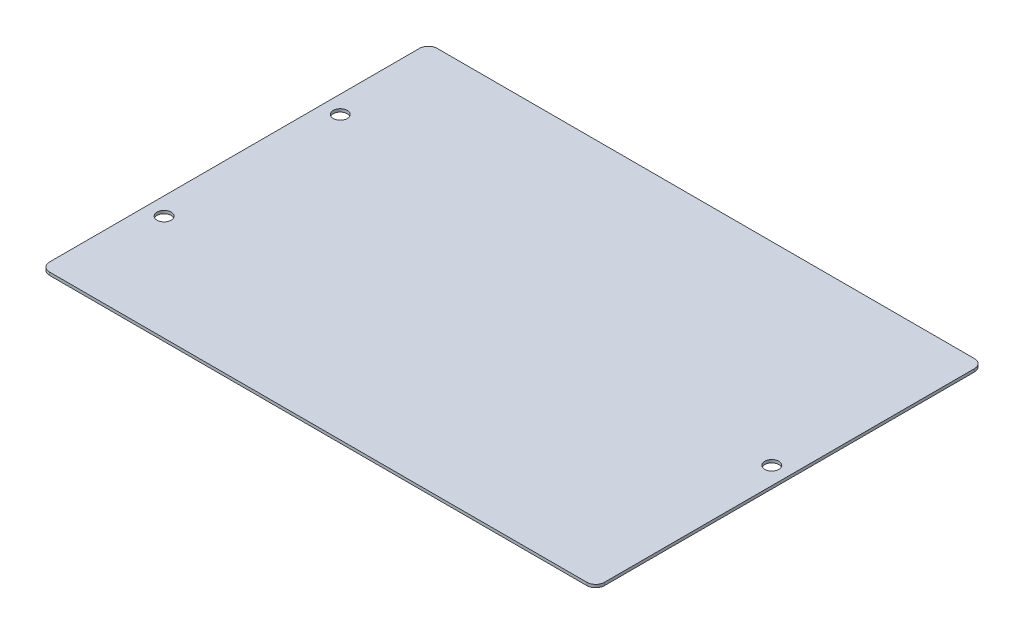
ISO-10303-21;
HEADER;
FILE_DESCRIPTION(('STEP AP214'),'2;1');
FILE_NAME('part.step','',(''),(''),'','','');
FILE_SCHEMA(('AUTOMOTIVE_DESIGN { 1 0 10303 214 1 1 1 1 }'));
ENDSEC;
DATA;
#1=APPLICATION_CONTEXT('core data for automotive mechanical design processes');
#2=APPLICATION_PROTOCOL_DEFINITION('international standard','automotive_design',2000,#1);
#3=PRODUCT_CONTEXT('',#1,'mechanical');
#4=PRODUCT('Part','Part','',(#3));
#5=PRODUCT_RELATED_PRODUCT_CATEGORY('part','',(#4));
#6=PRODUCT_DEFINITION_FORMATION('','',#4);
#7=PRODUCT_DEFINITION_CONTEXT('part definition',#1,'design');
#8=PRODUCT_DEFINITION('design','',#6,#7);
#9=PRODUCT_DEFINITION_SHAPE('','',#8);
#10=(LENGTH_UNIT() NAMED_UNIT(*) SI_UNIT(.MILLI.,.METRE.));
#11=(NAMED_UNIT(*) PLANE_ANGLE_UNIT() SI_UNIT($,.RADIAN.));
#12=(NAMED_UNIT(*) SI_UNIT($,.STERADIAN.) SOLID_ANGLE_UNIT());
#13=UNCERTAINTY_MEASURE_WITH_UNIT(LENGTH_MEASURE(1.E-05),#10,'distance_accuracy_value','');
#14=(GEOMETRIC_REPRESENTATION_CONTEXT(3) GLOBAL_UNCERTAINTY_ASSIGNED_CONTEXT((#13)) GLOBAL_UNIT_ASSIGNED_CONTEXT((#10,
#11,#12)) REPRESENTATION_CONTEXT('',''));
#15=CARTESIAN_POINT('',(0.,0.,0.));
#16=DIRECTION('',(0.,0.,1.));
#17=DIRECTION('',(1.,0.,0.));
#18=AXIS2_PLACEMENT_3D('',#15,#16,#17);
#19=CARTESIAN_POINT('',(94.5,1.,-66.));
#20=DIRECTION('',(-1.,0.,0.));
#21=DIRECTION('',(0.,0.,1.));
#22=AXIS2_PLACEMENT_3D('',#19,#20,#21);
#23=PLANE('',#22);
#24=DIRECTION('',(0.,0.,-1.));
#25=VECTOR('',#24,1.);
#26=CARTESIAN_POINT('',(94.5,1.,-66.));
#27=LINE('',#26,#25);
#28=CARTESIAN_POINT('',(94.5,1.,63.));
#29=VERTEX_POINT('',#28);
#30=CARTESIAN_POINT('',(94.5,1.,-63.));
#31=VERTEX_POINT('',#30);
#32=EDGE_CURVE('E118',#29,#31,#27,.T.);
#33=ORIENTED_EDGE('',*,*,#32,.F.);
#34=DIRECTION('',(0.,-1.,0.));
#35=VECTOR('',#34,1.);
#36=CARTESIAN_POINT('',(94.5,1.,63.));
#37=LINE('',#36,#35);
#38=CARTESIAN_POINT('',(94.5,0.,63.));
#39=VERTEX_POINT('',#38);
#40=EDGE_CURVE('E103',#29,#39,#37,.T.);
#41=ORIENTED_EDGE('',*,*,#40,.T.);
#42=DIRECTION('',(0.,0.,-1.));
#43=VECTOR('',#42,1.);
#44=CARTESIAN_POINT('',(94.5,0.,-66.));
#45=LINE('',#44,#43);
#46=CARTESIAN_POINT('',(94.5,0.,-63.));
#47=VERTEX_POINT('',#46);
#48=EDGE_CURVE('E115',#39,#47,#45,.T.);
#49=ORIENTED_EDGE('',*,*,#48,.T.);
#50=DIRECTION('',(0.,-1.,0.));
#51=VECTOR('',#50,1.);
#52=CARTESIAN_POINT('',(94.5,1.,-63.));
#53=LINE('',#52,#51);
#54=EDGE_CURVE('E120',#47,#31,#53,.F.);
#55=ORIENTED_EDGE('',*,*,#54,.T.);
#56=EDGE_LOOP('',(#33,#41,#49,#55));
#57=FACE_BOUND('',#56,.T.);
#58=ADVANCED_FACE('F34',(#57),#23,.F.);
#59=CARTESIAN_POINT('',(-94.5,1.,-66.));
#60=DIRECTION('',(0.,0.,1.));
#61=DIRECTION('',(1.,0.,0.));
#62=AXIS2_PLACEMENT_3D('',#59,#60,#61);
#63=PLANE('',#62);
#64=DIRECTION('',(-1.,0.,0.));
#65=VECTOR('',#64,1.);
#66=CARTESIAN_POINT('',(-94.5,1.,-66.));
#67=LINE('',#66,#65);
#68=CARTESIAN_POINT('',(91.5,1.,-66.));
#69=VERTEX_POINT('',#68);
#70=CARTESIAN_POINT('',(-91.5,1.,-66.));
#71=VERTEX_POINT('',#70);
#72=EDGE_CURVE('E173',#69,#71,#67,.T.);
#73=ORIENTED_EDGE('',*,*,#72,.F.);
#74=DIRECTION('',(0.,-1.,0.));
#75=VECTOR('',#74,1.);
#76=CARTESIAN_POINT('',(91.5,1.,-66.));
#77=LINE('',#76,#75);
#78=CARTESIAN_POINT('',(91.5,0.,-66.));
#79=VERTEX_POINT('',#78);
#80=EDGE_CURVE('E157',#69,#79,#77,.T.);
#81=ORIENTED_EDGE('',*,*,#80,.T.);
#82=DIRECTION('',(-1.,0.,0.));
#83=VECTOR('',#82,1.);
#84=CARTESIAN_POINT('',(-94.5,0.,-66.));
#85=LINE('',#84,#83);
#86=CARTESIAN_POINT('',(-91.5,0.,-66.));
#87=VERTEX_POINT('',#86);
#88=EDGE_CURVE('E124',#79,#87,#85,.T.);
#89=ORIENTED_EDGE('',*,*,#88,.T.);
#90=DIRECTION('',(0.,-1.,0.));
#91=VECTOR('',#90,1.);
#92=CARTESIAN_POINT('',(-91.5,1.,-66.));
#93=LINE('',#92,#91);
#94=EDGE_CURVE('E155',#87,#71,#93,.F.);
#95=ORIENTED_EDGE('',*,*,#94,.T.);
#96=EDGE_LOOP('',(#73,#81,#89,#95));
#97=FACE_BOUND('',#96,.T.);
#98=ADVANCED_FACE('F222',(#97),#63,.F.);
#99=CARTESIAN_POINT('',(-94.5,1.,-66.));
#100=DIRECTION('',(1.,0.,0.));
#101=DIRECTION('',(0.,0.,-1.));
#102=AXIS2_PLACEMENT_3D('',#99,#100,#101);
#103=PLANE('',#102);
#104=DIRECTION('',(0.,0.,1.));
#105=VECTOR('',#104,1.);
#106=CARTESIAN_POINT('',(-94.5,0.,-66.));
#107=LINE('',#106,#105);
#108=CARTESIAN_POINT('',(-94.5,0.,-63.));
#109=VERTEX_POINT('',#108);
#110=CARTESIAN_POINT('',(-94.5,0.,63.));
#111=VERTEX_POINT('',#110);
#112=EDGE_CURVE('E128',#109,#111,#107,.T.);
#113=ORIENTED_EDGE('',*,*,#112,.T.);
#114=DIRECTION('',(0.,-1.,0.));
#115=VECTOR('',#114,1.);
#116=CARTESIAN_POINT('',(-94.5,1.,63.));
#117=LINE('',#116,#115);
#118=CARTESIAN_POINT('',(-94.5,1.,63.));
#119=VERTEX_POINT('',#118);
#120=EDGE_CURVE('E11',#111,#119,#117,.F.);
#121=ORIENTED_EDGE('',*,*,#120,.T.);
#122=DIRECTION('',(0.,0.,1.));
#123=VECTOR('',#122,1.);
#124=CARTESIAN_POINT('',(-94.5,1.,-66.));
#125=LINE('',#124,#123);
#126=CARTESIAN_POINT('',(-94.5,1.,-63.));
#127=VERTEX_POINT('',#126);
#128=EDGE_CURVE('E163',#127,#119,#125,.T.);
#129=ORIENTED_EDGE('',*,*,#128,.F.);
#130=DIRECTION('',(0.,-1.,0.));
#131=VECTOR('',#130,1.);
#132=CARTESIAN_POINT('',(-94.5,1.,-63.));
#133=LINE('',#132,#131);
#134=EDGE_CURVE('E42',#127,#109,#133,.T.);
#135=ORIENTED_EDGE('',*,*,#134,.T.);
#136=EDGE_LOOP('',(#113,#121,#129,#135));
#137=FACE_BOUND('',#136,.T.);
#138=ADVANCED_FACE('F162',(#137),#103,.F.);
#139=CARTESIAN_POINT('',(-94.5,1.,66.));
#140=DIRECTION('',(0.,0.,-1.));
#141=DIRECTION('',(-1.,0.,0.));
#142=AXIS2_PLACEMENT_3D('',#139,#140,#141);
#143=PLANE('',#142);
#144=DIRECTION('',(1.,0.,0.));
#145=VECTOR('',#144,1.);
#146=CARTESIAN_POINT('',(-94.5,0.,66.));
#147=LINE('',#146,#145);
#148=CARTESIAN_POINT('',(-91.5,0.,66.));
#149=VERTEX_POINT('',#148);
#150=CARTESIAN_POINT('',(91.5,0.,66.));
#151=VERTEX_POINT('',#150);
#152=EDGE_CURVE('E138',#149,#151,#147,.T.);
#153=ORIENTED_EDGE('',*,*,#152,.T.);
#154=DIRECTION('',(0.,-1.,0.));
#155=VECTOR('',#154,1.);
#156=CARTESIAN_POINT('',(91.5,1.,66.));
#157=LINE('',#156,#155);
#158=CARTESIAN_POINT('',(91.5,1.,66.));
#159=VERTEX_POINT('',#158);
#160=EDGE_CURVE('E104',#151,#159,#157,.F.);
#161=ORIENTED_EDGE('',*,*,#160,.T.);
#162=DIRECTION('',(1.,0.,0.));
#163=VECTOR('',#162,1.);
#164=CARTESIAN_POINT('',(-94.5,1.,66.));
#165=LINE('',#164,#163);
#166=CARTESIAN_POINT('',(-91.5,1.,66.));
#167=VERTEX_POINT('',#166);
#168=EDGE_CURVE('E134',#167,#159,#165,.T.);
#169=ORIENTED_EDGE('',*,*,#168,.F.);
#170=DIRECTION('',(0.,-1.,0.));
#171=VECTOR('',#170,1.);
#172=CARTESIAN_POINT('',(-91.5,1.,66.));
#173=LINE('',#172,#171);
#174=EDGE_CURVE('E109',#167,#149,#173,.T.);
#175=ORIENTED_EDGE('',*,*,#174,.T.);
#176=EDGE_LOOP('',(#153,#161,#169,#175));
#177=FACE_BOUND('',#176,.T.);
#178=ADVANCED_FACE('F171',(#177),#143,.F.);
#179=CARTESIAN_POINT('',(94.5,1.,66.));
#180=DIRECTION('',(0.,1.,0.));
#181=DIRECTION('',(0.,0.,1.));
#182=AXIS2_PLACEMENT_3D('',#179,#180,#181);
#183=PLANE('',#182);
#184=CARTESIAN_POINT('',(-88.5,1.,-30.));
#185=DIRECTION('',(0.,1.,0.));
#186=DIRECTION('',(0.,0.,1.));
#187=AXIS2_PLACEMENT_3D('',#184,#185,#186);
#188=CIRCLE('',#187,2.4);
#189=CARTESIAN_POINT('',(-88.5,1.,-27.6));
#190=VERTEX_POINT('',#189);
#191=EDGE_CURVE('E186',#190,#190,#188,.T.);
#192=ORIENTED_EDGE('',*,*,#191,.F.);
#193=EDGE_LOOP('',(#192));
#194=FACE_BOUND('',#193,.T.);
#195=CARTESIAN_POINT('',(-88.5,1.,30.));
#196=DIRECTION('',(0.,1.,0.));
#197=DIRECTION('',(0.,0.,1.));
#198=AXIS2_PLACEMENT_3D('',#195,#196,#197);
#199=CIRCLE('',#198,2.4);
#200=CARTESIAN_POINT('',(-88.5,1.,32.4));
#201=VERTEX_POINT('',#200);
#202=EDGE_CURVE('E180',#201,#201,#199,.T.);
#203=ORIENTED_EDGE('',*,*,#202,.F.);
#204=EDGE_LOOP('',(#203));
#205=FACE_BOUND('',#204,.T.);
#206=CARTESIAN_POINT('',(88.5,1.,0.));
#207=DIRECTION('',(0.,1.,0.));
#208=DIRECTION('',(0.,0.,1.));
#209=AXIS2_PLACEMENT_3D('',#206,#207,#208);
#210=CIRCLE('',#209,2.4);
#211=CARTESIAN_POINT('',(88.5,1.,2.4));
#212=VERTEX_POINT('',#211);
#213=EDGE_CURVE('E131',#212,#212,#210,.T.);
#214=ORIENTED_EDGE('',*,*,#213,.F.);
#215=EDGE_LOOP('',(#214));
#216=FACE_BOUND('',#215,.T.);
#217=ORIENTED_EDGE('',*,*,#168,.T.);
#218=CARTESIAN_POINT('',(91.5,1.,63.));
#219=DIRECTION('',(0.,1.,0.));
#220=DIRECTION('',(0.,0.,1.));
#221=AXIS2_PLACEMENT_3D('',#218,#219,#220);
#222=CIRCLE('',#221,3.);
#223=EDGE_CURVE('E153',#159,#29,#222,.T.);
#224=ORIENTED_EDGE('',*,*,#223,.T.);
#225=ORIENTED_EDGE('',*,*,#32,.T.);
#226=CARTESIAN_POINT('',(91.5,1.,-63.));
#227=DIRECTION('',(0.,1.,0.));
#228=DIRECTION('',(0.,0.,1.));
#229=AXIS2_PLACEMENT_3D('',#226,#227,#228);
#230=CIRCLE('',#229,3.);
#231=EDGE_CURVE('E151',#31,#69,#230,.T.);
#232=ORIENTED_EDGE('',*,*,#231,.T.);
#233=ORIENTED_EDGE('',*,*,#72,.T.);
#234=CARTESIAN_POINT('',(-91.5,1.,-63.));
#235=DIRECTION('',(0.,1.,0.));
#236=DIRECTION('',(0.,0.,1.));
#237=AXIS2_PLACEMENT_3D('',#234,#235,#236);
#238=CIRCLE('',#237,3.);
#239=EDGE_CURVE('E54',#71,#127,#238,.T.);
#240=ORIENTED_EDGE('',*,*,#239,.T.);
#241=ORIENTED_EDGE('',*,*,#128,.T.);
#242=CARTESIAN_POINT('',(-91.5,1.,63.));
#243=DIRECTION('',(0.,1.,0.));
#244=DIRECTION('',(0.,0.,1.));
#245=AXIS2_PLACEMENT_3D('',#242,#243,#244);
#246=CIRCLE('',#245,3.);
#247=EDGE_CURVE('E149',#119,#167,#246,.T.);
#248=ORIENTED_EDGE('',*,*,#247,.T.);
#249=EDGE_LOOP('',(#217,#224,#225,#232,#233,#240,#241,#248));
#250=FACE_BOUND('',#249,.T.);
#251=ADVANCED_FACE('F201',(#194,#205,#216,#250),#183,.T.);
#252=CARTESIAN_POINT('',(94.5,0.,66.));
#253=DIRECTION('',(0.,1.,0.));
#254=DIRECTION('',(0.,0.,1.));
#255=AXIS2_PLACEMENT_3D('',#252,#253,#254);
#256=PLANE('',#255);
#257=CARTESIAN_POINT('',(-88.5,0.,-30.));
#258=DIRECTION('',(0.,1.,0.));
#259=DIRECTION('',(0.,0.,1.));
#260=AXIS2_PLACEMENT_3D('',#257,#258,#259);
#261=CIRCLE('',#260,2.4);
#262=CARTESIAN_POINT('',(-88.5,0.,-27.6));
#263=VERTEX_POINT('',#262);
#264=EDGE_CURVE('E183',#263,#263,#261,.T.);
#265=ORIENTED_EDGE('',*,*,#264,.T.);
#266=EDGE_LOOP('',(#265));
#267=FACE_BOUND('',#266,.T.);
#268=CARTESIAN_POINT('',(-88.5,0.,30.));
#269=DIRECTION('',(0.,1.,0.));
#270=DIRECTION('',(0.,0.,1.));
#271=AXIS2_PLACEMENT_3D('',#268,#269,#270);
#272=CIRCLE('',#271,2.4);
#273=CARTESIAN_POINT('',(-88.5,0.,32.4));
#274=VERTEX_POINT('',#273);
#275=EDGE_CURVE('E178',#274,#274,#272,.T.);
#276=ORIENTED_EDGE('',*,*,#275,.T.);
#277=EDGE_LOOP('',(#276));
#278=FACE_BOUND('',#277,.T.);
#279=CARTESIAN_POINT('',(88.5,0.,0.));
#280=DIRECTION('',(0.,1.,0.));
#281=DIRECTION('',(0.,0.,1.));
#282=AXIS2_PLACEMENT_3D('',#279,#280,#281);
#283=CIRCLE('',#282,2.4);
#284=CARTESIAN_POINT('',(88.5,0.,2.4));
#285=VERTEX_POINT('',#284);
#286=EDGE_CURVE('E125',#285,#285,#283,.T.);
#287=ORIENTED_EDGE('',*,*,#286,.T.);
#288=EDGE_LOOP('',(#287));
#289=FACE_BOUND('',#288,.T.);
#290=ORIENTED_EDGE('',*,*,#48,.F.);
#291=CARTESIAN_POINT('',(91.5,0.,63.));
#292=DIRECTION('',(0.,1.,0.));
#293=DIRECTION('',(0.,0.,1.));
#294=AXIS2_PLACEMENT_3D('',#291,#292,#293);
#295=CIRCLE('',#294,3.);
#296=EDGE_CURVE('E99',#39,#151,#295,.F.);
#297=ORIENTED_EDGE('',*,*,#296,.T.);
#298=ORIENTED_EDGE('',*,*,#152,.F.);
#299=CARTESIAN_POINT('',(-91.5,0.,63.));
#300=DIRECTION('',(0.,1.,0.));
#301=DIRECTION('',(0.,0.,1.));
#302=AXIS2_PLACEMENT_3D('',#299,#300,#301);
#303=CIRCLE('',#302,3.);
#304=EDGE_CURVE('E142',#149,#111,#303,.F.);
#305=ORIENTED_EDGE('',*,*,#304,.T.);
#306=ORIENTED_EDGE('',*,*,#112,.F.);
#307=CARTESIAN_POINT('',(-91.5,0.,-63.));
#308=DIRECTION('',(0.,1.,0.));
#309=DIRECTION('',(0.,0.,1.));
#310=AXIS2_PLACEMENT_3D('',#307,#308,#309);
#311=CIRCLE('',#310,3.);
#312=EDGE_CURVE('E119',#109,#87,#311,.F.);
#313=ORIENTED_EDGE('',*,*,#312,.T.);
#314=ORIENTED_EDGE('',*,*,#88,.F.);
#315=CARTESIAN_POINT('',(91.5,0.,-63.));
#316=DIRECTION('',(0.,1.,0.));
#317=DIRECTION('',(0.,0.,1.));
#318=AXIS2_PLACEMENT_3D('',#315,#316,#317);
#319=CIRCLE('',#318,3.);
#320=EDGE_CURVE('E110',#79,#47,#319,.F.);
#321=ORIENTED_EDGE('',*,*,#320,.T.);
#322=EDGE_LOOP('',(#290,#297,#298,#305,#306,#313,#314,#321));
#323=FACE_BOUND('',#322,.T.);
#324=ADVANCED_FACE('F122',(#267,#278,#289,#323),#256,.F.);
#325=CARTESIAN_POINT('',(88.5,0.,0.));
#326=DIRECTION('',(0.,1.,0.));
#327=DIRECTION('',(0.,0.,1.));
#328=AXIS2_PLACEMENT_3D('',#325,#326,#327);
#329=CYLINDRICAL_SURFACE('',#328,2.4);
#330=ORIENTED_EDGE('',*,*,#286,.F.);
#331=EDGE_LOOP('',(#330));
#332=FACE_BOUND('',#331,.T.);
#333=ORIENTED_EDGE('',*,*,#213,.T.);
#334=EDGE_LOOP('',(#333));
#335=FACE_BOUND('',#334,.T.);
#336=ADVANCED_FACE('F209',(#332,#335),#329,.F.);
#337=CARTESIAN_POINT('',(-88.5,0.,30.));
#338=DIRECTION('',(0.,1.,0.));
#339=DIRECTION('',(0.,0.,1.));
#340=AXIS2_PLACEMENT_3D('',#337,#338,#339);
#341=CYLINDRICAL_SURFACE('',#340,2.4);
#342=ORIENTED_EDGE('',*,*,#275,.F.);
#343=EDGE_LOOP('',(#342));
#344=FACE_BOUND('',#343,.T.);
#345=ORIENTED_EDGE('',*,*,#202,.T.);
#346=EDGE_LOOP('',(#345));
#347=FACE_BOUND('',#346,.T.);
#348=ADVANCED_FACE('F197',(#344,#347),#341,.F.);
#349=CARTESIAN_POINT('',(-88.5,0.,-30.));
#350=DIRECTION('',(0.,1.,0.));
#351=DIRECTION('',(0.,0.,1.));
#352=AXIS2_PLACEMENT_3D('',#349,#350,#351);
#353=CYLINDRICAL_SURFACE('',#352,2.4);
#354=ORIENTED_EDGE('',*,*,#264,.F.);
#355=EDGE_LOOP('',(#354));
#356=FACE_BOUND('',#355,.T.);
#357=ORIENTED_EDGE('',*,*,#191,.T.);
#358=EDGE_LOOP('',(#357));
#359=FACE_BOUND('',#358,.T.);
#360=ADVANCED_FACE('F194',(#356,#359),#353,.F.);
#361=CARTESIAN_POINT('',(91.5,1.,63.));
#362=DIRECTION('',(0.,-1.,0.));
#363=DIRECTION('',(0.,0.,-1.));
#364=AXIS2_PLACEMENT_3D('',#361,#362,#363);
#365=CYLINDRICAL_SURFACE('',#364,3.);
#366=ORIENTED_EDGE('',*,*,#223,.F.);
#367=ORIENTED_EDGE('',*,*,#160,.F.);
#368=ORIENTED_EDGE('',*,*,#296,.F.);
#369=ORIENTED_EDGE('',*,*,#40,.F.);
#370=EDGE_LOOP('',(#366,#367,#368,#369));
#371=FACE_BOUND('',#370,.T.);
#372=ADVANCED_FACE('F102',(#371),#365,.T.);
#373=CARTESIAN_POINT('',(91.5,1.,-63.));
#374=DIRECTION('',(0.,-1.,0.));
#375=DIRECTION('',(0.,0.,-1.));
#376=AXIS2_PLACEMENT_3D('',#373,#374,#375);
#377=CYLINDRICAL_SURFACE('',#376,3.);
#378=ORIENTED_EDGE('',*,*,#231,.F.);
#379=ORIENTED_EDGE('',*,*,#54,.F.);
#380=ORIENTED_EDGE('',*,*,#320,.F.);
#381=ORIENTED_EDGE('',*,*,#80,.F.);
#382=EDGE_LOOP('',(#378,#379,#380,#381));
#383=FACE_BOUND('',#382,.T.);
#384=ADVANCED_FACE('F233',(#383),#377,.T.);
#385=CARTESIAN_POINT('',(-91.5,1.,63.));
#386=DIRECTION('',(0.,-1.,0.));
#387=DIRECTION('',(0.,0.,-1.));
#388=AXIS2_PLACEMENT_3D('',#385,#386,#387);
#389=CYLINDRICAL_SURFACE('',#388,3.);
#390=ORIENTED_EDGE('',*,*,#247,.F.);
#391=ORIENTED_EDGE('',*,*,#120,.F.);
#392=ORIENTED_EDGE('',*,*,#304,.F.);
#393=ORIENTED_EDGE('',*,*,#174,.F.);
#394=EDGE_LOOP('',(#390,#391,#392,#393));
#395=FACE_BOUND('',#394,.T.);
#396=ADVANCED_FACE('F168',(#395),#389,.T.);
#397=CARTESIAN_POINT('',(-91.5,1.,-63.));
#398=DIRECTION('',(0.,-1.,0.));
#399=DIRECTION('',(0.,0.,-1.));
#400=AXIS2_PLACEMENT_3D('',#397,#398,#399);
#401=CYLINDRICAL_SURFACE('',#400,3.);
#402=ORIENTED_EDGE('',*,*,#239,.F.);
#403=ORIENTED_EDGE('',*,*,#94,.F.);
#404=ORIENTED_EDGE('',*,*,#312,.F.);
#405=ORIENTED_EDGE('',*,*,#134,.F.);
#406=EDGE_LOOP('',(#402,#403,#404,#405));
#407=FACE_BOUND('',#406,.T.);
#408=ADVANCED_FACE('F36',(#407),#401,.T.);
#409=CLOSED_SHELL('',(#58,#98,#138,#178,#251,#324,#336,#348,#360,#372,#384,#396,#408));
#410=MANIFOLD_SOLID_BREP('B2',#409);
#411=ADVANCED_BREP_SHAPE_REPRESENTATION('',(#18,#410),#14);
#412=SHAPE_DEFINITION_REPRESENTATION(#9,#411);
ENDSEC;
END-ISO-10303-21;
